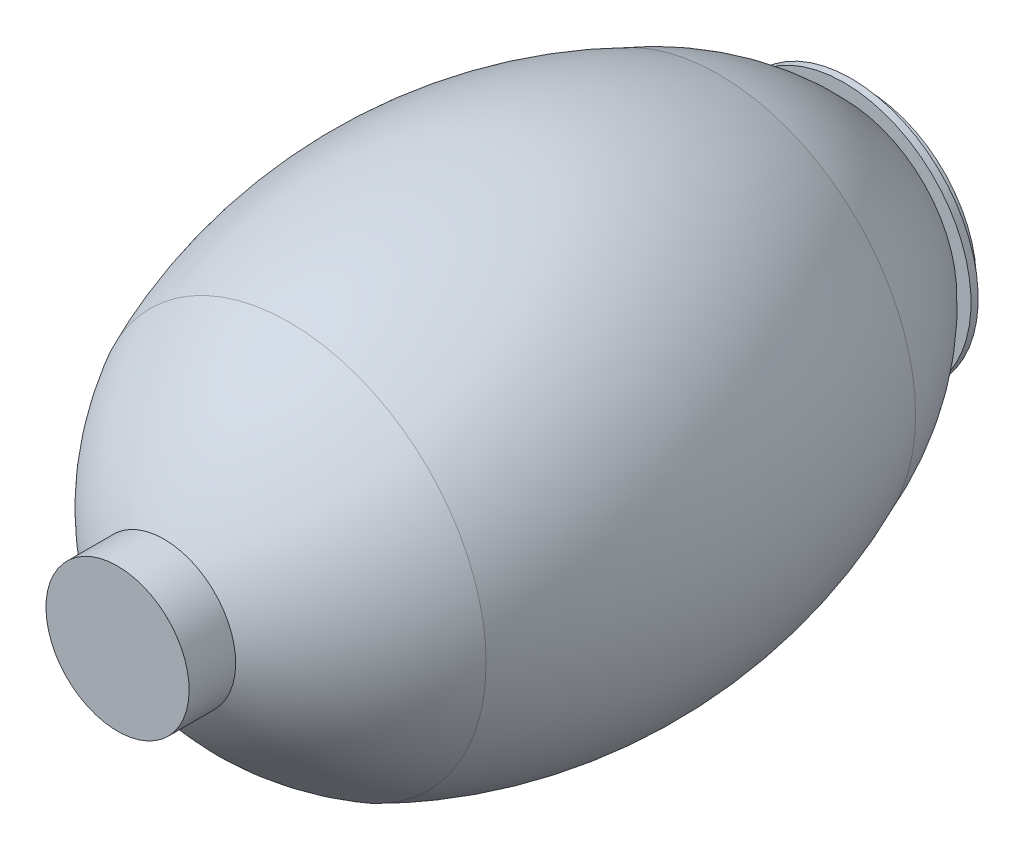
ISO-10303-21;
HEADER;
FILE_DESCRIPTION(('STEP AP214'),'2;1');
FILE_NAME('part.step','',(''),(''),'','','');
FILE_SCHEMA(('AUTOMOTIVE_DESIGN { 1 0 10303 214 1 1 1 1 }'));
ENDSEC;
DATA;
#1=APPLICATION_CONTEXT('core data for automotive mechanical design processes');
#2=APPLICATION_PROTOCOL_DEFINITION('international standard','automotive_design',2000,#1);
#3=PRODUCT_CONTEXT('',#1,'mechanical');
#4=PRODUCT('Part','Part','',(#3));
#5=PRODUCT_RELATED_PRODUCT_CATEGORY('part','',(#4));
#6=PRODUCT_DEFINITION_FORMATION('','',#4);
#7=PRODUCT_DEFINITION_CONTEXT('part definition',#1,'design');
#8=PRODUCT_DEFINITION('design','',#6,#7);
#9=PRODUCT_DEFINITION_SHAPE('','',#8);
#10=(LENGTH_UNIT() NAMED_UNIT(*) SI_UNIT(.MILLI.,.METRE.));
#11=(NAMED_UNIT(*) PLANE_ANGLE_UNIT() SI_UNIT($,.RADIAN.));
#12=(NAMED_UNIT(*) SI_UNIT($,.STERADIAN.) SOLID_ANGLE_UNIT());
#13=UNCERTAINTY_MEASURE_WITH_UNIT(LENGTH_MEASURE(1.E-05),#10,'distance_accuracy_value','');
#14=(GEOMETRIC_REPRESENTATION_CONTEXT(3) GLOBAL_UNCERTAINTY_ASSIGNED_CONTEXT((#13)) GLOBAL_UNIT_ASSIGNED_CONTEXT((#10,
#11,#12)) REPRESENTATION_CONTEXT('',''));
#15=CARTESIAN_POINT('',(0.,0.,0.));
#16=DIRECTION('',(0.,0.,1.));
#17=DIRECTION('',(1.,0.,0.));
#18=AXIS2_PLACEMENT_3D('',#15,#16,#17);
#19=CARTESIAN_POINT('',(0.,0.,0.));
#20=DIRECTION('',(0.,0.,-1.));
#21=DIRECTION('',(0.,1.,0.));
#22=AXIS2_PLACEMENT_3D('',#19,#20,#21);
#23=PLANE('',#22);
#24=CARTESIAN_POINT('',(0.,0.,0.));
#25=DIRECTION('',(0.,0.,-1.));
#26=DIRECTION('',(0.,1.,0.));
#27=AXIS2_PLACEMENT_3D('',#24,#25,#26);
#28=CIRCLE('',#27,20.);
#29=CARTESIAN_POINT('',(0.,20.,0.));
#30=VERTEX_POINT('',#29);
#31=EDGE_CURVE('E51',#30,#30,#28,.T.);
#32=ORIENTED_EDGE('',*,*,#31,.F.);
#33=EDGE_LOOP('',(#32));
#34=FACE_BOUND('',#33,.T.);
#35=ADVANCED_FACE('F36',(#34),#23,.F.);
#36=CARTESIAN_POINT('',(0.,0.,-209.));
#37=DIRECTION('',(0.,0.,-1.));
#38=DIRECTION('',(0.,1.,0.));
#39=AXIS2_PLACEMENT_3D('',#36,#37,#38);
#40=CYLINDRICAL_SURFACE('',#39,20.);
#41=CARTESIAN_POINT('',(0.,0.,-13.));
#42=DIRECTION('',(0.,0.,-1.));
#43=DIRECTION('',(0.,1.,0.));
#44=AXIS2_PLACEMENT_3D('',#41,#42,#43);
#45=CIRCLE('',#44,20.);
#46=CARTESIAN_POINT('',(0.,20.,-13.));
#47=VERTEX_POINT('',#46);
#48=EDGE_CURVE('E47',#47,#47,#45,.T.);
#49=ORIENTED_EDGE('',*,*,#48,.F.);
#50=EDGE_LOOP('',(#49));
#51=FACE_BOUND('',#50,.T.);
#52=ORIENTED_EDGE('',*,*,#31,.T.);
#53=EDGE_LOOP('',(#52));
#54=FACE_BOUND('',#53,.T.);
#55=ADVANCED_FACE('F104',(#51,#54),#40,.T.);
#56=CARTESIAN_POINT('',(0.,0.,-91.686191252602));
#57=DIRECTION('',(0.,0.,-1.));
#58=DIRECTION('',(0.,1.,0.));
#59=AXIS2_PLACEMENT_3D('',#56,#57,#58);
#60=DEGENERATE_TOROIDAL_SURFACE('',#59,23.6861912526021,90.,.F.);
#61=CARTESIAN_POINT('',(0.,0.,-48.));
#62=DIRECTION('',(0.,0.,-1.));
#63=DIRECTION('',(0.,1.,0.));
#64=AXIS2_PLACEMENT_3D('',#61,#62,#63);
#65=CIRCLE('',#64,55.);
#66=CARTESIAN_POINT('',(0.,55.,-48.));
#67=VERTEX_POINT('',#66);
#68=EDGE_CURVE('E43',#67,#67,#65,.T.);
#69=ORIENTED_EDGE('',*,*,#68,.F.);
#70=EDGE_LOOP('',(#69));
#71=FACE_BOUND('',#70,.T.);
#72=ORIENTED_EDGE('',*,*,#48,.T.);
#73=EDGE_LOOP('',(#72));
#74=FACE_BOUND('',#73,.T.);
#75=ADVANCED_FACE('F93',(#71,#74),#60,.F.);
#76=CARTESIAN_POINT('',(0.,0.,-108.));
#77=DIRECTION('',(0.,0.,-1.));
#78=DIRECTION('',(0.,1.,0.));
#79=AXIS2_PLACEMENT_3D('',#76,#77,#78);
#80=DEGENERATE_TOROIDAL_SURFACE('',#79,82.75,150.25,.F.);
#81=CARTESIAN_POINT('',(0.,0.,-168.));
#82=DIRECTION('',(0.,0.,-1.));
#83=DIRECTION('',(0.,1.,0.));
#84=AXIS2_PLACEMENT_3D('',#81,#82,#83);
#85=CIRCLE('',#84,55.);
#86=CARTESIAN_POINT('',(0.,55.,-168.));
#87=VERTEX_POINT('',#86);
#88=EDGE_CURVE('E11',#87,#87,#85,.T.);
#89=ORIENTED_EDGE('',*,*,#88,.F.);
#90=EDGE_LOOP('',(#89));
#91=FACE_BOUND('',#90,.T.);
#92=ORIENTED_EDGE('',*,*,#68,.T.);
#93=EDGE_LOOP('',(#92));
#94=FACE_BOUND('',#93,.T.);
#95=ADVANCED_FACE('F87',(#91,#94),#80,.F.);
#96=CARTESIAN_POINT('',(0.,0.,-203.));
#97=DIRECTION('',(0.,0.,-1.));
#98=DIRECTION('',(0.,1.,0.));
#99=AXIS2_PLACEMENT_3D('',#96,#97,#98);
#100=PLANE('',#99);
#101=CARTESIAN_POINT('',(0.,0.,-203.));
#102=DIRECTION('',(0.,0.,-1.));
#103=DIRECTION('',(0.,1.,0.));
#104=AXIS2_PLACEMENT_3D('',#101,#102,#103);
#105=CIRCLE('',#104,35.5);
#106=CARTESIAN_POINT('',(0.,35.5,-203.));
#107=VERTEX_POINT('',#106);
#108=EDGE_CURVE('E65',#107,#107,#105,.T.);
#109=ORIENTED_EDGE('',*,*,#108,.F.);
#110=EDGE_LOOP('',(#109));
#111=FACE_BOUND('',#110,.T.);
#112=CARTESIAN_POINT('',(0.,0.,-203.));
#113=DIRECTION('',(0.,0.,-1.));
#114=DIRECTION('',(0.,1.,0.));
#115=AXIS2_PLACEMENT_3D('',#112,#113,#114);
#116=CIRCLE('',#115,31.5);
#117=CARTESIAN_POINT('',(0.,31.5,-203.));
#118=VERTEX_POINT('',#117);
#119=EDGE_CURVE('E68',#118,#118,#116,.T.);
#120=ORIENTED_EDGE('',*,*,#119,.T.);
#121=EDGE_LOOP('',(#120));
#122=FACE_BOUND('',#121,.T.);
#123=ADVANCED_FACE('F72',(#111,#122),#100,.F.);
#124=CARTESIAN_POINT('',(0.,0.,-209.));
#125=DIRECTION('',(0.,0.,-1.));
#126=DIRECTION('',(0.,1.,0.));
#127=AXIS2_PLACEMENT_3D('',#124,#125,#126);
#128=CYLINDRICAL_SURFACE('',#127,35.5);
#129=CARTESIAN_POINT('',(0.,0.,-205.));
#130=DIRECTION('',(0.,0.,-1.));
#131=DIRECTION('',(0.,1.,0.));
#132=AXIS2_PLACEMENT_3D('',#129,#130,#131);
#133=CIRCLE('',#132,35.5);
#134=CARTESIAN_POINT('',(0.,35.5,-205.));
#135=VERTEX_POINT('',#134);
#136=EDGE_CURVE('E62',#135,#135,#133,.T.);
#137=ORIENTED_EDGE('',*,*,#136,.F.);
#138=EDGE_LOOP('',(#137));
#139=FACE_BOUND('',#138,.T.);
#140=ORIENTED_EDGE('',*,*,#108,.T.);
#141=EDGE_LOOP('',(#140));
#142=FACE_BOUND('',#141,.T.);
#143=ADVANCED_FACE('F76',(#139,#142),#128,.T.);
#144=CARTESIAN_POINT('',(0.,0.,-136.726300345806));
#145=DIRECTION('',(0.,0.,-1.));
#146=DIRECTION('',(0.,1.,0.));
#147=AXIS2_PLACEMENT_3D('',#144,#145,#146);
#148=DEGENERATE_TOROIDAL_SURFACE('',#147,29.3916803360335,90.,.F.);
#149=ORIENTED_EDGE('',*,*,#119,.F.);
#150=EDGE_LOOP('',(#149));
#151=FACE_BOUND('',#150,.T.);
#152=ORIENTED_EDGE('',*,*,#88,.T.);
#153=EDGE_LOOP('',(#152));
#154=FACE_BOUND('',#153,.T.);
#155=ADVANCED_FACE('F38',(#151,#154),#148,.F.);
#156=CARTESIAN_POINT('',(0.,0.,-205.));
#157=DIRECTION('',(0.,0.,1.));
#158=DIRECTION('',(0.,-1.,0.));
#159=AXIS2_PLACEMENT_3D('',#156,#157,#158);
#160=PLANE('',#159);
#161=CARTESIAN_POINT('',(0.,0.,-205.));
#162=DIRECTION('',(0.,0.,-1.));
#163=DIRECTION('',(0.,1.,0.));
#164=AXIS2_PLACEMENT_3D('',#161,#162,#163);
#165=CIRCLE('',#164,31.);
#166=CARTESIAN_POINT('',(0.,31.,-205.));
#167=VERTEX_POINT('',#166);
#168=EDGE_CURVE('E59',#167,#167,#165,.T.);
#169=ORIENTED_EDGE('',*,*,#168,.F.);
#170=EDGE_LOOP('',(#169));
#171=FACE_BOUND('',#170,.T.);
#172=ORIENTED_EDGE('',*,*,#136,.T.);
#173=EDGE_LOOP('',(#172));
#174=FACE_BOUND('',#173,.T.);
#175=ADVANCED_FACE('F75',(#171,#174),#160,.F.);
#176=CARTESIAN_POINT('',(0.,0.,-209.));
#177=DIRECTION('',(0.,0.,-1.));
#178=DIRECTION('',(0.,1.,0.));
#179=AXIS2_PLACEMENT_3D('',#176,#177,#178);
#180=CYLINDRICAL_SURFACE('',#179,31.);
#181=CARTESIAN_POINT('',(0.,0.,-209.));
#182=DIRECTION('',(0.,0.,-1.));
#183=DIRECTION('',(0.,1.,0.));
#184=AXIS2_PLACEMENT_3D('',#181,#182,#183);
#185=CIRCLE('',#184,31.);
#186=CARTESIAN_POINT('',(0.,31.,-209.));
#187=VERTEX_POINT('',#186);
#188=EDGE_CURVE('E56',#187,#187,#185,.T.);
#189=ORIENTED_EDGE('',*,*,#188,.F.);
#190=EDGE_LOOP('',(#189));
#191=FACE_BOUND('',#190,.T.);
#192=ORIENTED_EDGE('',*,*,#168,.T.);
#193=EDGE_LOOP('',(#192));
#194=FACE_BOUND('',#193,.T.);
#195=ADVANCED_FACE('F81',(#191,#194),#180,.T.);
#196=CARTESIAN_POINT('',(0.,0.,-209.));
#197=DIRECTION('',(0.,0.,1.));
#198=DIRECTION('',(0.,-1.,0.));
#199=AXIS2_PLACEMENT_3D('',#196,#197,#198);
#200=PLANE('',#199);
#201=ORIENTED_EDGE('',*,*,#188,.T.);
#202=EDGE_LOOP('',(#201));
#203=FACE_BOUND('',#202,.T.);
#204=ADVANCED_FACE('F99',(#203),#200,.F.);
#205=CLOSED_SHELL('',(#35,#55,#75,#95,#123,#143,#155,#175,#195,#204));
#206=MANIFOLD_SOLID_BREP('B2',#205);
#207=ADVANCED_BREP_SHAPE_REPRESENTATION('',(#18,#206),#14);
#208=SHAPE_DEFINITION_REPRESENTATION(#9,#207);
ENDSEC;
END-ISO-10303-21;
